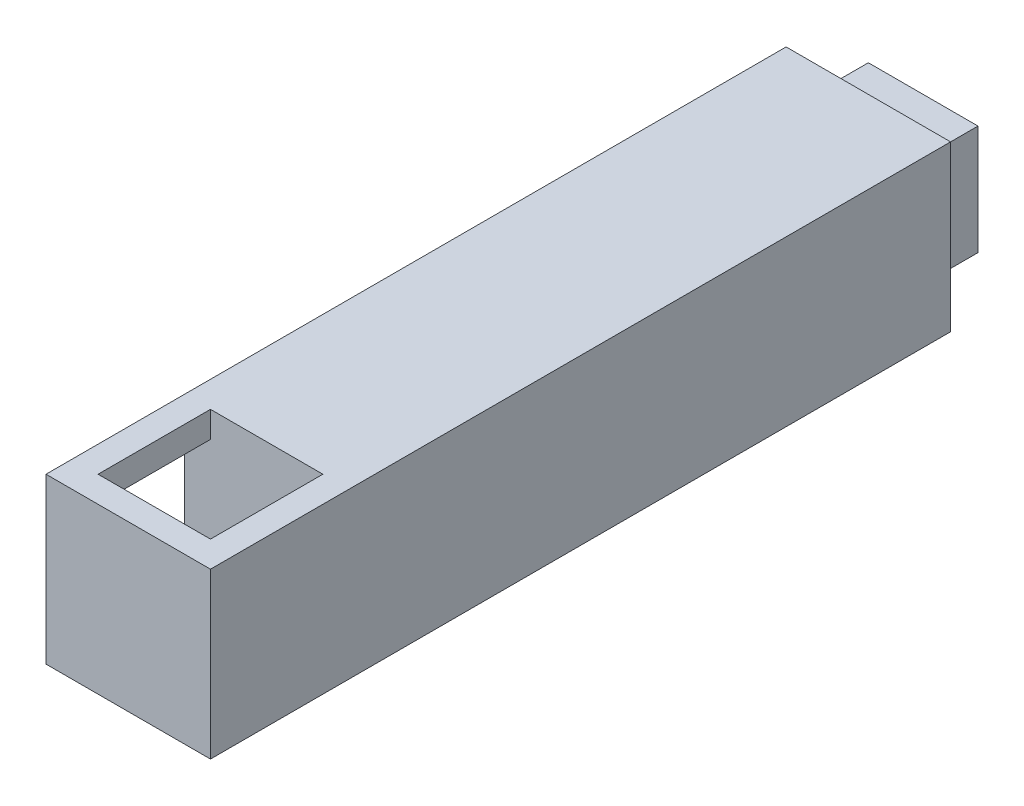
ISO-10303-21;
HEADER;
FILE_DESCRIPTION(('STEP AP214'),'2;1');
FILE_NAME('part.step','',(''),(''),'','','');
FILE_SCHEMA(('AUTOMOTIVE_DESIGN { 1 0 10303 214 1 1 1 1 }'));
ENDSEC;
DATA;
#1=APPLICATION_CONTEXT('core data for automotive mechanical design processes');
#2=APPLICATION_PROTOCOL_DEFINITION('international standard','automotive_design',2000,#1);
#3=PRODUCT_CONTEXT('',#1,'mechanical');
#4=PRODUCT('Part','Part','',(#3));
#5=PRODUCT_RELATED_PRODUCT_CATEGORY('part','',(#4));
#6=PRODUCT_DEFINITION_FORMATION('','',#4);
#7=PRODUCT_DEFINITION_CONTEXT('part definition',#1,'design');
#8=PRODUCT_DEFINITION('design','',#6,#7);
#9=PRODUCT_DEFINITION_SHAPE('','',#8);
#10=(LENGTH_UNIT() NAMED_UNIT(*) SI_UNIT(.MILLI.,.METRE.));
#11=(NAMED_UNIT(*) PLANE_ANGLE_UNIT() SI_UNIT($,.RADIAN.));
#12=(NAMED_UNIT(*) SI_UNIT($,.STERADIAN.) SOLID_ANGLE_UNIT());
#13=UNCERTAINTY_MEASURE_WITH_UNIT(LENGTH_MEASURE(1.E-05),#10,'distance_accuracy_value','');
#14=(GEOMETRIC_REPRESENTATION_CONTEXT(3) GLOBAL_UNCERTAINTY_ASSIGNED_CONTEXT((#13)) GLOBAL_UNIT_ASSIGNED_CONTEXT((#10,
#11,#12)) REPRESENTATION_CONTEXT('',''));
#15=CARTESIAN_POINT('',(0.,0.,0.));
#16=DIRECTION('',(0.,0.,1.));
#17=DIRECTION('',(1.,0.,0.));
#18=AXIS2_PLACEMENT_3D('',#15,#16,#17);
#19=CARTESIAN_POINT('',(0.,0.,0.));
#20=DIRECTION('',(-1.,0.,0.));
#21=DIRECTION('',(0.,0.,1.));
#22=AXIS2_PLACEMENT_3D('',#19,#20,#21);
#23=PLANE('',#22);
#24=DIRECTION('',(0.,1.,0.));
#25=VECTOR('',#24,1.);
#26=CARTESIAN_POINT('',(0.,-10.25,130.25));
#27=LINE('',#26,#25);
#28=CARTESIAN_POINT('',(0.,-10.25,130.25));
#29=VERTEX_POINT('',#28);
#30=CARTESIAN_POINT('',(0.,0.,130.25));
#31=VERTEX_POINT('',#30);
#32=EDGE_CURVE('E196',#29,#31,#27,.T.);
#33=ORIENTED_EDGE('',*,*,#32,.T.);
#34=DIRECTION('',(0.,0.,-1.));
#35=VECTOR('',#34,1.);
#36=CARTESIAN_POINT('',(0.,0.,0.));
#37=LINE('',#36,#35);
#38=CARTESIAN_POINT('',(0.,0.,109.75));
#39=VERTEX_POINT('',#38);
#40=EDGE_CURVE('E51',#31,#39,#37,.T.);
#41=ORIENTED_EDGE('',*,*,#40,.T.);
#42=DIRECTION('',(0.,-1.,0.));
#43=VECTOR('',#42,1.);
#44=CARTESIAN_POINT('',(0.,10.25,109.75));
#45=LINE('',#44,#43);
#46=CARTESIAN_POINT('',(0.,-10.25,109.75));
#47=VERTEX_POINT('',#46);
#48=EDGE_CURVE('E195',#39,#47,#45,.T.);
#49=ORIENTED_EDGE('',*,*,#48,.T.);
#50=DIRECTION('',(0.,0.,1.));
#51=VECTOR('',#50,1.);
#52=CARTESIAN_POINT('',(0.,-10.25,109.75));
#53=LINE('',#52,#51);
#54=EDGE_CURVE('E194',#47,#29,#53,.T.);
#55=ORIENTED_EDGE('',*,*,#54,.T.);
#56=EDGE_LOOP('',(#33,#41,#49,#55));
#57=FACE_BOUND('',#56,.T.);
#58=ADVANCED_FACE('F43',(#57),#23,.T.);
#59=CARTESIAN_POINT('',(0.,0.,0.));
#60=DIRECTION('',(0.,0.,-1.));
#61=DIRECTION('',(-1.,0.,0.));
#62=AXIS2_PLACEMENT_3D('',#59,#60,#61);
#63=PLANE('',#62);
#64=DIRECTION('',(0.,-1.,0.));
#65=VECTOR('',#64,1.);
#66=CARTESIAN_POINT('',(-15.,-15.,0.));
#67=LINE('',#66,#65);
#68=CARTESIAN_POINT('',(-15.,15.,0.));
#69=VERTEX_POINT('',#68);
#70=CARTESIAN_POINT('',(-15.,-15.,0.));
#71=VERTEX_POINT('',#70);
#72=EDGE_CURVE('E248',#69,#71,#67,.T.);
#73=ORIENTED_EDGE('',*,*,#72,.F.);
#74=DIRECTION('',(-1.,0.,0.));
#75=VECTOR('',#74,1.);
#76=CARTESIAN_POINT('',(-15.,15.,0.));
#77=LINE('',#76,#75);
#78=CARTESIAN_POINT('',(15.,15.,0.));
#79=VERTEX_POINT('',#78);
#80=EDGE_CURVE('E258',#79,#69,#77,.T.);
#81=ORIENTED_EDGE('',*,*,#80,.F.);
#82=DIRECTION('',(0.,1.,0.));
#83=VECTOR('',#82,1.);
#84=CARTESIAN_POINT('',(15.,-15.,0.));
#85=LINE('',#84,#83);
#86=CARTESIAN_POINT('',(15.,-15.,0.));
#87=VERTEX_POINT('',#86);
#88=EDGE_CURVE('E270',#87,#79,#85,.T.);
#89=ORIENTED_EDGE('',*,*,#88,.F.);
#90=DIRECTION('',(1.,0.,0.));
#91=VECTOR('',#90,1.);
#92=CARTESIAN_POINT('',(-15.,-15.,0.));
#93=LINE('',#92,#91);
#94=EDGE_CURVE('E264',#71,#87,#93,.T.);
#95=ORIENTED_EDGE('',*,*,#94,.F.);
#96=EDGE_LOOP('',(#73,#81,#89,#95));
#97=FACE_BOUND('',#96,.T.);
#98=DIRECTION('',(-1.,0.,0.));
#99=VECTOR('',#98,1.);
#100=CARTESIAN_POINT('',(-10.,10.,0.));
#101=LINE('',#100,#99);
#102=CARTESIAN_POINT('',(10.,10.,0.));
#103=VERTEX_POINT('',#102);
#104=CARTESIAN_POINT('',(-10.,10.,0.));
#105=VERTEX_POINT('',#104);
#106=EDGE_CURVE('E224',#103,#105,#101,.T.);
#107=ORIENTED_EDGE('',*,*,#106,.T.);
#108=DIRECTION('',(0.,-1.,0.));
#109=VECTOR('',#108,1.);
#110=CARTESIAN_POINT('',(-10.,-10.,0.));
#111=LINE('',#110,#109);
#112=CARTESIAN_POINT('',(-10.,-10.,0.));
#113=VERTEX_POINT('',#112);
#114=EDGE_CURVE('E215',#105,#113,#111,.T.);
#115=ORIENTED_EDGE('',*,*,#114,.T.);
#116=DIRECTION('',(1.,0.,0.));
#117=VECTOR('',#116,1.);
#118=CARTESIAN_POINT('',(-10.,-10.,0.));
#119=LINE('',#118,#117);
#120=CARTESIAN_POINT('',(10.,-10.,0.));
#121=VERTEX_POINT('',#120);
#122=EDGE_CURVE('E232',#113,#121,#119,.T.);
#123=ORIENTED_EDGE('',*,*,#122,.T.);
#124=DIRECTION('',(0.,1.,0.));
#125=VECTOR('',#124,1.);
#126=CARTESIAN_POINT('',(10.,-10.,0.));
#127=LINE('',#126,#125);
#128=EDGE_CURVE('E236',#121,#103,#127,.T.);
#129=ORIENTED_EDGE('',*,*,#128,.T.);
#130=EDGE_LOOP('',(#107,#115,#123,#129));
#131=FACE_BOUND('',#130,.T.);
#132=ADVANCED_FACE('F316',(#97,#131),#63,.T.);
#133=CARTESIAN_POINT('',(-15.,-15.,135.));
#134=DIRECTION('',(1.,0.,0.));
#135=DIRECTION('',(0.,0.,-1.));
#136=AXIS2_PLACEMENT_3D('',#133,#134,#135);
#137=PLANE('',#136);
#138=DIRECTION('',(0.,0.,1.));
#139=VECTOR('',#138,1.);
#140=CARTESIAN_POINT('',(-15.,-10.25,109.75));
#141=LINE('',#140,#139);
#142=CARTESIAN_POINT('',(-15.,-10.25,109.75));
#143=VERTEX_POINT('',#142);
#144=CARTESIAN_POINT('',(-15.,-10.25,130.25));
#145=VERTEX_POINT('',#144);
#146=EDGE_CURVE('E205',#143,#145,#141,.T.);
#147=ORIENTED_EDGE('',*,*,#146,.F.);
#148=DIRECTION('',(0.,-1.,0.));
#149=VECTOR('',#148,1.);
#150=CARTESIAN_POINT('',(-15.,10.25,109.75));
#151=LINE('',#150,#149);
#152=CARTESIAN_POINT('',(-15.,10.25,109.75));
#153=VERTEX_POINT('',#152);
#154=EDGE_CURVE('E186',#153,#143,#151,.T.);
#155=ORIENTED_EDGE('',*,*,#154,.F.);
#156=DIRECTION('',(0.,0.,-1.));
#157=VECTOR('',#156,1.);
#158=CARTESIAN_POINT('',(-15.,10.25,130.25));
#159=LINE('',#158,#157);
#160=CARTESIAN_POINT('',(-15.,10.25,130.25));
#161=VERTEX_POINT('',#160);
#162=EDGE_CURVE('E192',#161,#153,#159,.T.);
#163=ORIENTED_EDGE('',*,*,#162,.F.);
#164=DIRECTION('',(0.,1.,0.));
#165=VECTOR('',#164,1.);
#166=CARTESIAN_POINT('',(-15.,-10.25,130.25));
#167=LINE('',#166,#165);
#168=EDGE_CURVE('E202',#145,#161,#167,.T.);
#169=ORIENTED_EDGE('',*,*,#168,.F.);
#170=EDGE_LOOP('',(#147,#155,#163,#169));
#171=FACE_BOUND('',#170,.T.);
#172=ORIENTED_EDGE('',*,*,#72,.T.);
#173=DIRECTION('',(0.,0.,-1.));
#174=VECTOR('',#173,1.);
#175=CARTESIAN_POINT('',(-15.,-15.,135.));
#176=LINE('',#175,#174);
#177=CARTESIAN_POINT('',(-15.,-15.,135.));
#178=VERTEX_POINT('',#177);
#179=EDGE_CURVE('E279',#178,#71,#176,.T.);
#180=ORIENTED_EDGE('',*,*,#179,.F.);
#181=DIRECTION('',(0.,-1.,0.));
#182=VECTOR('',#181,1.);
#183=CARTESIAN_POINT('',(-15.,-15.,135.));
#184=LINE('',#183,#182);
#185=CARTESIAN_POINT('',(-15.,15.,135.));
#186=VERTEX_POINT('',#185);
#187=EDGE_CURVE('E252',#186,#178,#184,.T.);
#188=ORIENTED_EDGE('',*,*,#187,.F.);
#189=DIRECTION('',(0.,0.,-1.));
#190=VECTOR('',#189,1.);
#191=CARTESIAN_POINT('',(-15.,15.,135.));
#192=LINE('',#191,#190);
#193=EDGE_CURVE('E265',#186,#69,#192,.T.);
#194=ORIENTED_EDGE('',*,*,#193,.T.);
#195=EDGE_LOOP('',(#172,#180,#188,#194));
#196=FACE_BOUND('',#195,.T.);
#197=ADVANCED_FACE('F44',(#171,#196),#137,.F.);
#198=CARTESIAN_POINT('',(-15.,-15.,135.));
#199=DIRECTION('',(0.,1.,0.));
#200=DIRECTION('',(0.,0.,1.));
#201=AXIS2_PLACEMENT_3D('',#198,#199,#200);
#202=PLANE('',#201);
#203=ORIENTED_EDGE('',*,*,#94,.T.);
#204=DIRECTION('',(0.,0.,-1.));
#205=VECTOR('',#204,1.);
#206=CARTESIAN_POINT('',(15.,-15.,135.));
#207=LINE('',#206,#205);
#208=CARTESIAN_POINT('',(15.,-15.,135.));
#209=VERTEX_POINT('',#208);
#210=EDGE_CURVE('E274',#209,#87,#207,.T.);
#211=ORIENTED_EDGE('',*,*,#210,.F.);
#212=DIRECTION('',(1.,0.,0.));
#213=VECTOR('',#212,1.);
#214=CARTESIAN_POINT('',(-15.,-15.,135.));
#215=LINE('',#214,#213);
#216=EDGE_CURVE('E254',#178,#209,#215,.T.);
#217=ORIENTED_EDGE('',*,*,#216,.F.);
#218=ORIENTED_EDGE('',*,*,#179,.T.);
#219=EDGE_LOOP('',(#203,#211,#217,#218));
#220=FACE_BOUND('',#219,.T.);
#221=ADVANCED_FACE('F319',(#220),#202,.F.);
#222=CARTESIAN_POINT('',(15.,-15.,135.));
#223=DIRECTION('',(-1.,0.,0.));
#224=DIRECTION('',(0.,0.,1.));
#225=AXIS2_PLACEMENT_3D('',#222,#223,#224);
#226=PLANE('',#225);
#227=ORIENTED_EDGE('',*,*,#88,.T.);
#228=DIRECTION('',(0.,0.,-1.));
#229=VECTOR('',#228,1.);
#230=CARTESIAN_POINT('',(15.,15.,135.));
#231=LINE('',#230,#229);
#232=CARTESIAN_POINT('',(15.,15.,135.));
#233=VERTEX_POINT('',#232);
#234=EDGE_CURVE('E275',#233,#79,#231,.T.);
#235=ORIENTED_EDGE('',*,*,#234,.F.);
#236=DIRECTION('',(0.,1.,0.));
#237=VECTOR('',#236,1.);
#238=CARTESIAN_POINT('',(15.,-15.,135.));
#239=LINE('',#238,#237);
#240=EDGE_CURVE('E256',#209,#233,#239,.T.);
#241=ORIENTED_EDGE('',*,*,#240,.F.);
#242=ORIENTED_EDGE('',*,*,#210,.T.);
#243=EDGE_LOOP('',(#227,#235,#241,#242));
#244=FACE_BOUND('',#243,.T.);
#245=ADVANCED_FACE('F302',(#244),#226,.F.);
#246=CARTESIAN_POINT('',(-15.,15.,135.));
#247=DIRECTION('',(0.,-1.,0.));
#248=DIRECTION('',(0.,0.,-1.));
#249=AXIS2_PLACEMENT_3D('',#246,#247,#248);
#250=PLANE('',#249);
#251=DIRECTION('',(1.,0.,0.));
#252=VECTOR('',#251,1.);
#253=CARTESIAN_POINT('',(-10.25,15.,130.25));
#254=LINE('',#253,#252);
#255=CARTESIAN_POINT('',(-10.25,15.,130.25));
#256=VERTEX_POINT('',#255);
#257=CARTESIAN_POINT('',(10.25,15.,130.25));
#258=VERTEX_POINT('',#257);
#259=EDGE_CURVE('E168',#256,#258,#254,.T.);
#260=ORIENTED_EDGE('',*,*,#259,.F.);
#261=DIRECTION('',(0.,0.,1.));
#262=VECTOR('',#261,1.);
#263=CARTESIAN_POINT('',(-10.25,15.,109.75));
#264=LINE('',#263,#262);
#265=CARTESIAN_POINT('',(-10.25,15.,109.75));
#266=VERTEX_POINT('',#265);
#267=EDGE_CURVE('E59',#266,#256,#264,.T.);
#268=ORIENTED_EDGE('',*,*,#267,.F.);
#269=DIRECTION('',(-1.,0.,0.));
#270=VECTOR('',#269,1.);
#271=CARTESIAN_POINT('',(10.25,15.,109.75));
#272=LINE('',#271,#270);
#273=CARTESIAN_POINT('',(10.25,15.,109.75));
#274=VERTEX_POINT('',#273);
#275=EDGE_CURVE('E162',#274,#266,#272,.T.);
#276=ORIENTED_EDGE('',*,*,#275,.F.);
#277=DIRECTION('',(0.,0.,-1.));
#278=VECTOR('',#277,1.);
#279=CARTESIAN_POINT('',(10.25,15.,130.25));
#280=LINE('',#279,#278);
#281=EDGE_CURVE('E181',#258,#274,#280,.T.);
#282=ORIENTED_EDGE('',*,*,#281,.F.);
#283=EDGE_LOOP('',(#260,#268,#276,#282));
#284=FACE_BOUND('',#283,.T.);
#285=ORIENTED_EDGE('',*,*,#80,.T.);
#286=ORIENTED_EDGE('',*,*,#193,.F.);
#287=DIRECTION('',(-1.,0.,0.));
#288=VECTOR('',#287,1.);
#289=CARTESIAN_POINT('',(-15.,15.,135.));
#290=LINE('',#289,#288);
#291=EDGE_CURVE('E257',#233,#186,#290,.T.);
#292=ORIENTED_EDGE('',*,*,#291,.F.);
#293=ORIENTED_EDGE('',*,*,#234,.T.);
#294=EDGE_LOOP('',(#285,#286,#292,#293));
#295=FACE_BOUND('',#294,.T.);
#296=ADVANCED_FACE('F303',(#284,#295),#250,.F.);
#297=CARTESIAN_POINT('',(0.,0.,135.));
#298=DIRECTION('',(0.,0.,-1.));
#299=DIRECTION('',(-1.,0.,0.));
#300=AXIS2_PLACEMENT_3D('',#297,#298,#299);
#301=PLANE('',#300);
#302=ORIENTED_EDGE('',*,*,#187,.T.);
#303=ORIENTED_EDGE('',*,*,#216,.T.);
#304=ORIENTED_EDGE('',*,*,#240,.T.);
#305=ORIENTED_EDGE('',*,*,#291,.T.);
#306=EDGE_LOOP('',(#302,#303,#304,#305));
#307=FACE_BOUND('',#306,.T.);
#308=ADVANCED_FACE('F304',(#307),#301,.F.);
#309=CARTESIAN_POINT('',(-10.,-10.,-10.));
#310=DIRECTION('',(-1.,0.,0.));
#311=DIRECTION('',(0.,0.,1.));
#312=AXIS2_PLACEMENT_3D('',#309,#310,#311);
#313=PLANE('',#312);
#314=ORIENTED_EDGE('',*,*,#114,.F.);
#315=DIRECTION('',(0.,0.,1.));
#316=VECTOR('',#315,1.);
#317=CARTESIAN_POINT('',(-10.,10.,-10.));
#318=LINE('',#317,#316);
#319=CARTESIAN_POINT('',(-10.,10.,-10.));
#320=VERTEX_POINT('',#319);
#321=EDGE_CURVE('E244',#320,#105,#318,.T.);
#322=ORIENTED_EDGE('',*,*,#321,.F.);
#323=DIRECTION('',(0.,-1.,0.));
#324=VECTOR('',#323,1.);
#325=CARTESIAN_POINT('',(-10.,-10.,-10.));
#326=LINE('',#325,#324);
#327=CARTESIAN_POINT('',(-10.,-10.,-10.));
#328=VERTEX_POINT('',#327);
#329=EDGE_CURVE('E218',#320,#328,#326,.T.);
#330=ORIENTED_EDGE('',*,*,#329,.T.);
#331=DIRECTION('',(0.,0.,1.));
#332=VECTOR('',#331,1.);
#333=CARTESIAN_POINT('',(-10.,-10.,-10.));
#334=LINE('',#333,#332);
#335=EDGE_CURVE('E235',#328,#113,#334,.T.);
#336=ORIENTED_EDGE('',*,*,#335,.T.);
#337=EDGE_LOOP('',(#314,#322,#330,#336));
#338=FACE_BOUND('',#337,.T.);
#339=ADVANCED_FACE('F358',(#338),#313,.T.);
#340=CARTESIAN_POINT('',(-10.,10.,-10.));
#341=DIRECTION('',(0.,1.,0.));
#342=DIRECTION('',(0.,0.,1.));
#343=AXIS2_PLACEMENT_3D('',#340,#341,#342);
#344=PLANE('',#343);
#345=ORIENTED_EDGE('',*,*,#106,.F.);
#346=DIRECTION('',(0.,0.,1.));
#347=VECTOR('',#346,1.);
#348=CARTESIAN_POINT('',(10.,10.,-10.));
#349=LINE('',#348,#347);
#350=CARTESIAN_POINT('',(10.,10.,-10.));
#351=VERTEX_POINT('',#350);
#352=EDGE_CURVE('E250',#351,#103,#349,.T.);
#353=ORIENTED_EDGE('',*,*,#352,.F.);
#354=DIRECTION('',(-1.,0.,0.));
#355=VECTOR('',#354,1.);
#356=CARTESIAN_POINT('',(-10.,10.,-10.));
#357=LINE('',#356,#355);
#358=EDGE_CURVE('E226',#351,#320,#357,.T.);
#359=ORIENTED_EDGE('',*,*,#358,.T.);
#360=ORIENTED_EDGE('',*,*,#321,.T.);
#361=EDGE_LOOP('',(#345,#353,#359,#360));
#362=FACE_BOUND('',#361,.T.);
#363=ADVANCED_FACE('F355',(#362),#344,.T.);
#364=CARTESIAN_POINT('',(10.,-10.,-10.));
#365=DIRECTION('',(1.,0.,0.));
#366=DIRECTION('',(0.,0.,-1.));
#367=AXIS2_PLACEMENT_3D('',#364,#365,#366);
#368=PLANE('',#367);
#369=ORIENTED_EDGE('',*,*,#128,.F.);
#370=DIRECTION('',(0.,0.,1.));
#371=VECTOR('',#370,1.);
#372=CARTESIAN_POINT('',(10.,-10.,-10.));
#373=LINE('',#372,#371);
#374=CARTESIAN_POINT('',(10.,-10.,-10.));
#375=VERTEX_POINT('',#374);
#376=EDGE_CURVE('E249',#375,#121,#373,.T.);
#377=ORIENTED_EDGE('',*,*,#376,.F.);
#378=DIRECTION('',(0.,1.,0.));
#379=VECTOR('',#378,1.);
#380=CARTESIAN_POINT('',(10.,-10.,-10.));
#381=LINE('',#380,#379);
#382=EDGE_CURVE('E227',#375,#351,#381,.T.);
#383=ORIENTED_EDGE('',*,*,#382,.T.);
#384=ORIENTED_EDGE('',*,*,#352,.T.);
#385=EDGE_LOOP('',(#369,#377,#383,#384));
#386=FACE_BOUND('',#385,.T.);
#387=ADVANCED_FACE('F353',(#386),#368,.T.);
#388=CARTESIAN_POINT('',(-10.,-10.,-10.));
#389=DIRECTION('',(0.,-1.,0.));
#390=DIRECTION('',(0.,0.,-1.));
#391=AXIS2_PLACEMENT_3D('',#388,#389,#390);
#392=PLANE('',#391);
#393=ORIENTED_EDGE('',*,*,#122,.F.);
#394=ORIENTED_EDGE('',*,*,#335,.F.);
#395=DIRECTION('',(1.,0.,0.));
#396=VECTOR('',#395,1.);
#397=CARTESIAN_POINT('',(-10.,-10.,-10.));
#398=LINE('',#397,#396);
#399=EDGE_CURVE('E225',#328,#375,#398,.T.);
#400=ORIENTED_EDGE('',*,*,#399,.T.);
#401=ORIENTED_EDGE('',*,*,#376,.T.);
#402=EDGE_LOOP('',(#393,#394,#400,#401));
#403=FACE_BOUND('',#402,.T.);
#404=ADVANCED_FACE('F348',(#403),#392,.T.);
#405=CARTESIAN_POINT('',(0.,0.,-10.));
#406=DIRECTION('',(0.,0.,-1.));
#407=DIRECTION('',(-1.,0.,0.));
#408=AXIS2_PLACEMENT_3D('',#405,#406,#407);
#409=PLANE('',#408);
#410=ORIENTED_EDGE('',*,*,#329,.F.);
#411=ORIENTED_EDGE('',*,*,#358,.F.);
#412=ORIENTED_EDGE('',*,*,#382,.F.);
#413=ORIENTED_EDGE('',*,*,#399,.F.);
#414=EDGE_LOOP('',(#410,#411,#412,#413));
#415=FACE_BOUND('',#414,.T.);
#416=ADVANCED_FACE('F350',(#415),#409,.T.);
#417=CARTESIAN_POINT('',(0.,10.25,109.75));
#418=DIRECTION('',(0.,0.,-1.));
#419=DIRECTION('',(-1.,0.,0.));
#420=AXIS2_PLACEMENT_3D('',#417,#418,#419);
#421=PLANE('',#420);
#422=ORIENTED_EDGE('',*,*,#48,.F.);
#423=DIRECTION('',(-1.,0.,0.));
#424=VECTOR('',#423,1.);
#425=CARTESIAN_POINT('',(10.25,0.,109.75));
#426=LINE('',#425,#424);
#427=CARTESIAN_POINT('',(10.25,0.,109.75));
#428=VERTEX_POINT('',#427);
#429=EDGE_CURVE('E68',#428,#39,#426,.T.);
#430=ORIENTED_EDGE('',*,*,#429,.F.);
#431=DIRECTION('',(0.,1.,0.));
#432=VECTOR('',#431,1.);
#433=CARTESIAN_POINT('',(10.25,0.,109.75));
#434=LINE('',#433,#432);
#435=EDGE_CURVE('E171',#428,#274,#434,.T.);
#436=ORIENTED_EDGE('',*,*,#435,.T.);
#437=ORIENTED_EDGE('',*,*,#275,.T.);
#438=DIRECTION('',(0.,1.,0.));
#439=VECTOR('',#438,1.);
#440=CARTESIAN_POINT('',(-10.25,0.,109.75));
#441=LINE('',#440,#439);
#442=CARTESIAN_POINT('',(-10.25,10.25,109.75));
#443=VERTEX_POINT('',#442);
#444=EDGE_CURVE('E190',#443,#266,#441,.T.);
#445=ORIENTED_EDGE('',*,*,#444,.F.);
#446=DIRECTION('',(-1.,0.,0.));
#447=VECTOR('',#446,1.);
#448=CARTESIAN_POINT('',(0.,10.25,109.75));
#449=LINE('',#448,#447);
#450=EDGE_CURVE('E209',#443,#153,#449,.T.);
#451=ORIENTED_EDGE('',*,*,#450,.T.);
#452=ORIENTED_EDGE('',*,*,#154,.T.);
#453=DIRECTION('',(-1.,0.,0.));
#454=VECTOR('',#453,1.);
#455=CARTESIAN_POINT('',(0.,-10.25,109.75));
#456=LINE('',#455,#454);
#457=EDGE_CURVE('E199',#47,#143,#456,.T.);
#458=ORIENTED_EDGE('',*,*,#457,.F.);
#459=EDGE_LOOP('',(#422,#430,#436,#437,#445,#451,#452,#458));
#460=FACE_BOUND('',#459,.T.);
#461=ADVANCED_FACE('F281',(#460),#421,.F.);
#462=CARTESIAN_POINT('',(0.,10.25,130.25));
#463=DIRECTION('',(0.,1.,0.));
#464=DIRECTION('',(0.,0.,1.));
#465=AXIS2_PLACEMENT_3D('',#462,#463,#464);
#466=PLANE('',#465);
#467=ORIENTED_EDGE('',*,*,#450,.F.);
#468=DIRECTION('',(0.,0.,1.));
#469=VECTOR('',#468,1.);
#470=CARTESIAN_POINT('',(-10.25,10.25,130.25));
#471=LINE('',#470,#469);
#472=CARTESIAN_POINT('',(-10.25,10.25,130.25));
#473=VERTEX_POINT('',#472);
#474=EDGE_CURVE('E11',#443,#473,#471,.T.);
#475=ORIENTED_EDGE('',*,*,#474,.T.);
#476=DIRECTION('',(-1.,0.,0.));
#477=VECTOR('',#476,1.);
#478=CARTESIAN_POINT('',(0.,10.25,130.25));
#479=LINE('',#478,#477);
#480=EDGE_CURVE('E213',#473,#161,#479,.T.);
#481=ORIENTED_EDGE('',*,*,#480,.T.);
#482=ORIENTED_EDGE('',*,*,#162,.T.);
#483=EDGE_LOOP('',(#467,#475,#481,#482));
#484=FACE_BOUND('',#483,.T.);
#485=ADVANCED_FACE('F297',(#484),#466,.F.);
#486=CARTESIAN_POINT('',(0.,-10.25,130.25));
#487=DIRECTION('',(0.,0.,1.));
#488=DIRECTION('',(1.,0.,0.));
#489=AXIS2_PLACEMENT_3D('',#486,#487,#488);
#490=PLANE('',#489);
#491=ORIENTED_EDGE('',*,*,#480,.F.);
#492=DIRECTION('',(0.,1.,0.));
#493=VECTOR('',#492,1.);
#494=CARTESIAN_POINT('',(-10.25,0.,130.25));
#495=LINE('',#494,#493);
#496=EDGE_CURVE('E173',#473,#256,#495,.T.);
#497=ORIENTED_EDGE('',*,*,#496,.T.);
#498=ORIENTED_EDGE('',*,*,#259,.T.);
#499=DIRECTION('',(0.,1.,0.));
#500=VECTOR('',#499,1.);
#501=CARTESIAN_POINT('',(10.25,0.,130.25));
#502=LINE('',#501,#500);
#503=CARTESIAN_POINT('',(10.25,0.,130.25));
#504=VERTEX_POINT('',#503);
#505=EDGE_CURVE('E167',#504,#258,#502,.T.);
#506=ORIENTED_EDGE('',*,*,#505,.F.);
#507=DIRECTION('',(1.,0.,0.));
#508=VECTOR('',#507,1.);
#509=CARTESIAN_POINT('',(-10.25,0.,130.25));
#510=LINE('',#509,#508);
#511=EDGE_CURVE('E154',#31,#504,#510,.T.);
#512=ORIENTED_EDGE('',*,*,#511,.F.);
#513=ORIENTED_EDGE('',*,*,#32,.F.);
#514=DIRECTION('',(-1.,0.,0.));
#515=VECTOR('',#514,1.);
#516=CARTESIAN_POINT('',(0.,-10.25,130.25));
#517=LINE('',#516,#515);
#518=EDGE_CURVE('E214',#29,#145,#517,.T.);
#519=ORIENTED_EDGE('',*,*,#518,.T.);
#520=ORIENTED_EDGE('',*,*,#168,.T.);
#521=EDGE_LOOP('',(#491,#497,#498,#506,#512,#513,#519,#520));
#522=FACE_BOUND('',#521,.T.);
#523=ADVANCED_FACE('F169',(#522),#490,.F.);
#524=CARTESIAN_POINT('',(0.,-10.25,109.75));
#525=DIRECTION('',(0.,-1.,0.));
#526=DIRECTION('',(0.,0.,-1.));
#527=AXIS2_PLACEMENT_3D('',#524,#525,#526);
#528=PLANE('',#527);
#529=ORIENTED_EDGE('',*,*,#146,.T.);
#530=ORIENTED_EDGE('',*,*,#518,.F.);
#531=ORIENTED_EDGE('',*,*,#54,.F.);
#532=ORIENTED_EDGE('',*,*,#457,.T.);
#533=EDGE_LOOP('',(#529,#530,#531,#532));
#534=FACE_BOUND('',#533,.T.);
#535=ADVANCED_FACE('F289',(#534),#528,.F.);
#536=CARTESIAN_POINT('',(-10.25,0.,109.75));
#537=DIRECTION('',(-1.,0.,0.));
#538=DIRECTION('',(0.,0.,1.));
#539=AXIS2_PLACEMENT_3D('',#536,#537,#538);
#540=PLANE('',#539);
#541=ORIENTED_EDGE('',*,*,#444,.T.);
#542=ORIENTED_EDGE('',*,*,#267,.T.);
#543=ORIENTED_EDGE('',*,*,#496,.F.);
#544=ORIENTED_EDGE('',*,*,#474,.F.);
#545=EDGE_LOOP('',(#541,#542,#543,#544));
#546=FACE_BOUND('',#545,.T.);
#547=ADVANCED_FACE('F299',(#546),#540,.F.);
#548=CARTESIAN_POINT('',(10.25,0.,130.25));
#549=DIRECTION('',(1.,0.,0.));
#550=DIRECTION('',(0.,0.,-1.));
#551=AXIS2_PLACEMENT_3D('',#548,#549,#550);
#552=PLANE('',#551);
#553=ORIENTED_EDGE('',*,*,#281,.T.);
#554=ORIENTED_EDGE('',*,*,#435,.F.);
#555=DIRECTION('',(0.,0.,-1.));
#556=VECTOR('',#555,1.);
#557=CARTESIAN_POINT('',(10.25,0.,130.25));
#558=LINE('',#557,#556);
#559=EDGE_CURVE('E157',#504,#428,#558,.T.);
#560=ORIENTED_EDGE('',*,*,#559,.F.);
#561=ORIENTED_EDGE('',*,*,#505,.T.);
#562=EDGE_LOOP('',(#553,#554,#560,#561));
#563=FACE_BOUND('',#562,.T.);
#564=ADVANCED_FACE('F180',(#563),#552,.F.);
#565=CARTESIAN_POINT('',(0.,0.,0.));
#566=DIRECTION('',(0.,1.,0.));
#567=DIRECTION('',(0.,0.,1.));
#568=AXIS2_PLACEMENT_3D('',#565,#566,#567);
#569=PLANE('',#568);
#570=ORIENTED_EDGE('',*,*,#511,.T.);
#571=ORIENTED_EDGE('',*,*,#559,.T.);
#572=ORIENTED_EDGE('',*,*,#429,.T.);
#573=ORIENTED_EDGE('',*,*,#40,.F.);
#574=EDGE_LOOP('',(#570,#571,#572,#573));
#575=FACE_BOUND('',#574,.T.);
#576=ADVANCED_FACE('F160',(#575),#569,.T.);
#577=CLOSED_SHELL('',(#58,#132,#197,#221,#245,#296,#308,#339,#363,#387,#404,#416,#461,#485,#523,
#535,#547,#564,#576));
#578=MANIFOLD_SOLID_BREP('B2',#577);
#579=ADVANCED_BREP_SHAPE_REPRESENTATION('',(#18,#578),#14);
#580=SHAPE_DEFINITION_REPRESENTATION(#9,#579);
ENDSEC;
END-ISO-10303-21;
